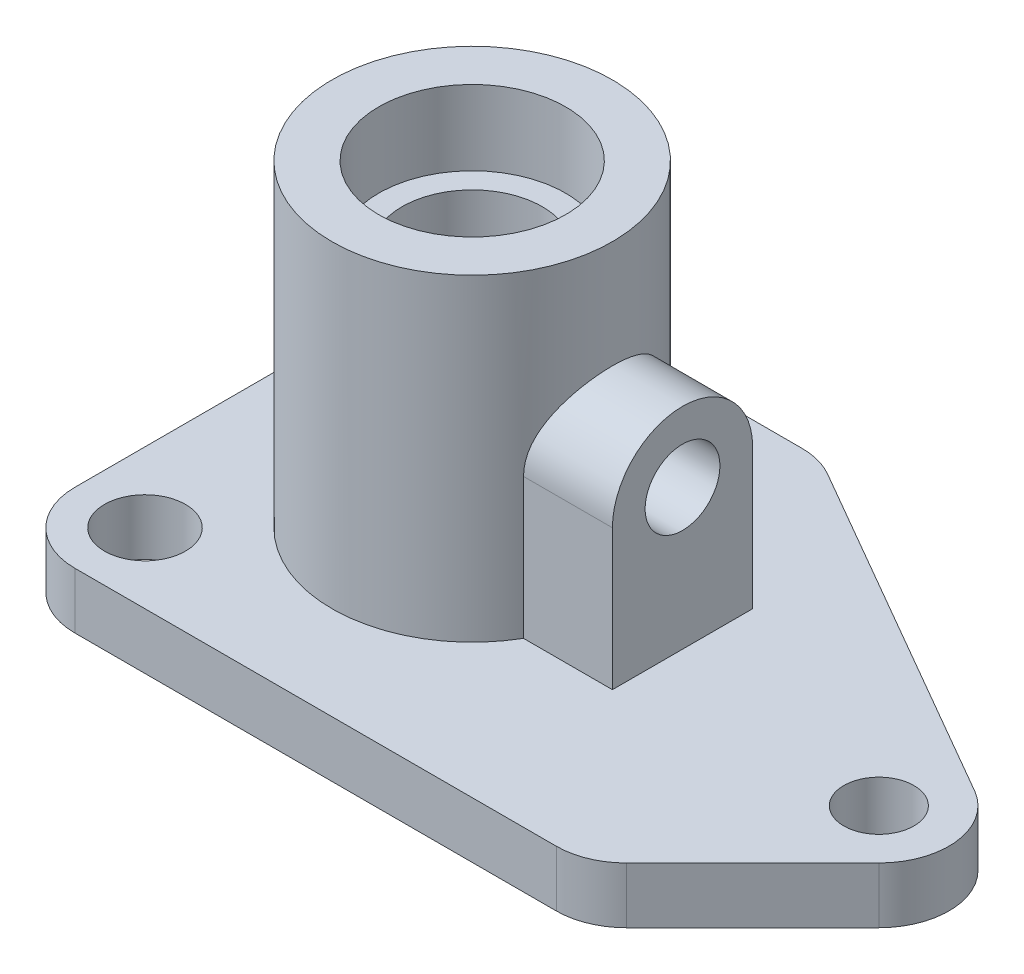
ISO-10303-21;
HEADER;
FILE_DESCRIPTION(('STEP AP214'),'2;1');
FILE_NAME('part.step','',(''),(''),'','','');
FILE_SCHEMA(('AUTOMOTIVE_DESIGN { 1 0 10303 214 1 1 1 1 }'));
ENDSEC;
DATA;
#1=APPLICATION_CONTEXT('core data for automotive mechanical design processes');
#2=APPLICATION_PROTOCOL_DEFINITION('international standard','automotive_design',2000,#1);
#3=PRODUCT_CONTEXT('',#1,'mechanical');
#4=PRODUCT('Part','Part','',(#3));
#5=PRODUCT_RELATED_PRODUCT_CATEGORY('part','',(#4));
#6=PRODUCT_DEFINITION_FORMATION('','',#4);
#7=PRODUCT_DEFINITION_CONTEXT('part definition',#1,'design');
#8=PRODUCT_DEFINITION('design','',#6,#7);
#9=PRODUCT_DEFINITION_SHAPE('','',#8);
#10=(LENGTH_UNIT() NAMED_UNIT(*) SI_UNIT(.MILLI.,.METRE.));
#11=(NAMED_UNIT(*) PLANE_ANGLE_UNIT() SI_UNIT($,.RADIAN.));
#12=(NAMED_UNIT(*) SI_UNIT($,.STERADIAN.) SOLID_ANGLE_UNIT());
#13=UNCERTAINTY_MEASURE_WITH_UNIT(LENGTH_MEASURE(1.E-05),#10,'distance_accuracy_value','');
#14=(GEOMETRIC_REPRESENTATION_CONTEXT(3) GLOBAL_UNCERTAINTY_ASSIGNED_CONTEXT((#13)) GLOBAL_UNIT_ASSIGNED_CONTEXT((#10,
#11,#12)) REPRESENTATION_CONTEXT('',''));
#15=CARTESIAN_POINT('',(0.,0.,0.));
#16=DIRECTION('',(0.,0.,1.));
#17=DIRECTION('',(1.,0.,0.));
#18=AXIS2_PLACEMENT_3D('',#15,#16,#17);
#19=CARTESIAN_POINT('',(145.,12.,-42.));
#20=DIRECTION('',(0.,-1.,0.));
#21=DIRECTION('',(0.,0.,-1.));
#22=AXIS2_PLACEMENT_3D('',#19,#20,#21);
#23=PLANE('',#22);
#24=DIRECTION('',(0.,0.,-1.));
#25=VECTOR('',#24,1.);
#26=CARTESIAN_POINT('',(95.,12.,-35.));
#27=LINE('',#26,#25);
#28=CARTESIAN_POINT('',(95.,12.,-35.));
#29=VERTEX_POINT('',#28);
#30=CARTESIAN_POINT('',(95.,12.,-65.));
#31=VERTEX_POINT('',#30);
#32=EDGE_CURVE('E283',#29,#31,#27,.T.);
#33=ORIENTED_EDGE('',*,*,#32,.F.);
#34=DIRECTION('',(1.,0.,0.));
#35=VECTOR('',#34,1.);
#36=CARTESIAN_POINT('',(-0.001000000000001,12.,-35.));
#37=LINE('',#36,#35);
#38=CARTESIAN_POINT('',(75.9807621135332,12.,-35.));
#39=VERTEX_POINT('',#38);
#40=EDGE_CURVE('E273',#39,#29,#37,.T.);
#41=ORIENTED_EDGE('',*,*,#40,.F.);
#42=CARTESIAN_POINT('',(50.,12.,-50.));
#43=DIRECTION('',(0.,-1.,0.));
#44=DIRECTION('',(0.,0.,-1.));
#45=AXIS2_PLACEMENT_3D('',#42,#43,#44);
#46=CIRCLE('',#45,30.);
#47=CARTESIAN_POINT('',(75.9807621135332,12.,-65.));
#48=VERTEX_POINT('',#47);
#49=EDGE_CURVE('E11',#48,#39,#46,.F.);
#50=ORIENTED_EDGE('',*,*,#49,.F.);
#51=DIRECTION('',(1.,0.,0.));
#52=VECTOR('',#51,1.);
#53=CARTESIAN_POINT('',(-0.001000000000001,12.,-65.));
#54=LINE('',#53,#52);
#55=EDGE_CURVE('E277',#48,#31,#54,.T.);
#56=ORIENTED_EDGE('',*,*,#55,.T.);
#57=EDGE_LOOP('',(#33,#41,#50,#56));
#58=FACE_BOUND('',#57,.T.);
#59=CARTESIAN_POINT('',(145.,12.,-42.));
#60=DIRECTION('',(0.,1.,0.));
#61=DIRECTION('',(0.,0.,-1.));
#62=AXIS2_PLACEMENT_3D('',#59,#60,#61);
#63=CIRCLE('',#62,15.);
#64=CARTESIAN_POINT('',(155.606601717798,12.,-31.3933982822018));
#65=VERTEX_POINT('',#64);
#66=CARTESIAN_POINT('',(152.5,12.,-54.9903810567666));
#67=VERTEX_POINT('',#66);
#68=EDGE_CURVE('E174',#65,#67,#63,.T.);
#69=ORIENTED_EDGE('',*,*,#68,.T.);
#70=DIRECTION('',(-0.866025403784438,0.,-0.500000000000001));
#71=VECTOR('',#70,1.);
#72=CARTESIAN_POINT('',(78.0218152745385,12.,-97.9903810567666));
#73=LINE('',#72,#71);
#74=CARTESIAN_POINT('',(78.0218152745385,12.,-97.9903810567666));
#75=VERTEX_POINT('',#74);
#76=EDGE_CURVE('E105',#67,#75,#73,.T.);
#77=ORIENTED_EDGE('',*,*,#76,.T.);
#78=CARTESIAN_POINT('',(70.5218152745385,12.,-85.));
#79=DIRECTION('',(0.,1.,0.));
#80=DIRECTION('',(0.,0.,1.));
#81=AXIS2_PLACEMENT_3D('',#78,#79,#80);
#82=CIRCLE('',#81,15.);
#83=CARTESIAN_POINT('',(70.5218152745385,12.,-100.));
#84=VERTEX_POINT('',#83);
#85=EDGE_CURVE('E214',#75,#84,#82,.T.);
#86=ORIENTED_EDGE('',*,*,#85,.T.);
#87=DIRECTION('',(-1.,0.,0.));
#88=VECTOR('',#87,1.);
#89=CARTESIAN_POINT('',(15.0000000000001,12.,-100.));
#90=LINE('',#89,#88);
#91=CARTESIAN_POINT('',(15.0000000000001,12.,-100.));
#92=VERTEX_POINT('',#91);
#93=EDGE_CURVE('E211',#84,#92,#90,.T.);
#94=ORIENTED_EDGE('',*,*,#93,.T.);
#95=CARTESIAN_POINT('',(15.,12.,-85.));
#96=DIRECTION('',(0.,1.,0.));
#97=DIRECTION('',(0.,0.,-1.));
#98=AXIS2_PLACEMENT_3D('',#95,#96,#97);
#99=CIRCLE('',#98,15.);
#100=CARTESIAN_POINT('',(0.,12.,-84.9999999999999));
#101=VERTEX_POINT('',#100);
#102=EDGE_CURVE('E213',#92,#101,#99,.T.);
#103=ORIENTED_EDGE('',*,*,#102,.T.);
#104=DIRECTION('',(0.,0.,1.));
#105=VECTOR('',#104,1.);
#106=CARTESIAN_POINT('',(0.,12.,-15.));
#107=LINE('',#106,#105);
#108=CARTESIAN_POINT('',(0.,12.,-15.));
#109=VERTEX_POINT('',#108);
#110=EDGE_CURVE('E216',#101,#109,#107,.T.);
#111=ORIENTED_EDGE('',*,*,#110,.T.);
#112=CARTESIAN_POINT('',(15.,12.,-15.));
#113=DIRECTION('',(0.,1.,0.));
#114=DIRECTION('',(0.,0.,-1.));
#115=AXIS2_PLACEMENT_3D('',#112,#113,#114);
#116=CIRCLE('',#115,15.);
#117=CARTESIAN_POINT('',(15.,12.,0.));
#118=VERTEX_POINT('',#117);
#119=EDGE_CURVE('E133',#109,#118,#116,.T.);
#120=ORIENTED_EDGE('',*,*,#119,.T.);
#121=DIRECTION('',(1.,0.,0.));
#122=VECTOR('',#121,1.);
#123=CARTESIAN_POINT('',(118.,12.,0.));
#124=LINE('',#123,#122);
#125=CARTESIAN_POINT('',(118.,12.,0.));
#126=VERTEX_POINT('',#125);
#127=EDGE_CURVE('E126',#118,#126,#124,.T.);
#128=ORIENTED_EDGE('',*,*,#127,.T.);
#129=CARTESIAN_POINT('',(118.,12.,-15.));
#130=DIRECTION('',(0.,1.,0.));
#131=DIRECTION('',(0.,0.,-1.));
#132=AXIS2_PLACEMENT_3D('',#129,#130,#131);
#133=CIRCLE('',#132,15.);
#134=CARTESIAN_POINT('',(128.606601717798,12.,-4.39339828220181));
#135=VERTEX_POINT('',#134);
#136=EDGE_CURVE('E130',#126,#135,#133,.T.);
#137=ORIENTED_EDGE('',*,*,#136,.T.);
#138=DIRECTION('',(0.707106781186546,0.,-0.707106781186549));
#139=VECTOR('',#138,1.);
#140=CARTESIAN_POINT('',(155.606601717798,12.,-31.3933982822018));
#141=LINE('',#140,#139);
#142=EDGE_CURVE('E57',#135,#65,#141,.T.);
#143=ORIENTED_EDGE('',*,*,#142,.T.);
#144=EDGE_LOOP('',(#69,#77,#86,#94,#103,#111,#120,#128,#137,#143));
#145=FACE_BOUND('',#144,.T.);
#146=CARTESIAN_POINT('',(15.,12.,-85.));
#147=DIRECTION('',(0.,1.,0.));
#148=DIRECTION('',(0.,0.,1.));
#149=AXIS2_PLACEMENT_3D('',#146,#147,#148);
#150=CIRCLE('',#149,7.5);
#151=CARTESIAN_POINT('',(15.,12.,-77.5));
#152=VERTEX_POINT('',#151);
#153=EDGE_CURVE('E158',#152,#152,#150,.T.);
#154=ORIENTED_EDGE('',*,*,#153,.F.);
#155=EDGE_LOOP('',(#154));
#156=FACE_BOUND('',#155,.T.);
#157=CARTESIAN_POINT('',(15.,12.,-15.));
#158=DIRECTION('',(0.,1.,0.));
#159=DIRECTION('',(0.,0.,1.));
#160=AXIS2_PLACEMENT_3D('',#157,#158,#159);
#161=CIRCLE('',#160,8.66710245401889);
#162=CARTESIAN_POINT('',(15.,12.,-6.33289754598109));
#163=VERTEX_POINT('',#162);
#164=EDGE_CURVE('E236',#163,#163,#161,.T.);
#165=ORIENTED_EDGE('',*,*,#164,.F.);
#166=EDGE_LOOP('',(#165));
#167=FACE_BOUND('',#166,.T.);
#168=CARTESIAN_POINT('',(145.,12.,-42.));
#169=DIRECTION('',(0.,1.,0.));
#170=DIRECTION('',(0.,0.,1.));
#171=AXIS2_PLACEMENT_3D('',#168,#169,#170);
#172=CIRCLE('',#171,7.50000000000001);
#173=CARTESIAN_POINT('',(145.,12.,-34.5));
#174=VERTEX_POINT('',#173);
#175=EDGE_CURVE('E242',#174,#174,#172,.T.);
#176=ORIENTED_EDGE('',*,*,#175,.F.);
#177=EDGE_LOOP('',(#176));
#178=FACE_BOUND('',#177,.T.);
#179=ADVANCED_FACE('F33',(#58,#145,#156,#167,#178),#23,.F.);
#180=CARTESIAN_POINT('',(145.,0.,-42.));
#181=DIRECTION('',(0.,-1.,0.));
#182=DIRECTION('',(0.,0.,-1.));
#183=AXIS2_PLACEMENT_3D('',#180,#181,#182);
#184=PLANE('',#183);
#185=CARTESIAN_POINT('',(50.,0.,-50.));
#186=DIRECTION('',(0.,1.,0.));
#187=DIRECTION('',(0.,0.,1.));
#188=AXIS2_PLACEMENT_3D('',#185,#186,#187);
#189=CIRCLE('',#188,15.);
#190=CARTESIAN_POINT('',(50.,0.,-35.));
#191=VERTEX_POINT('',#190);
#192=EDGE_CURVE('E253',#191,#191,#189,.T.);
#193=ORIENTED_EDGE('',*,*,#192,.T.);
#194=EDGE_LOOP('',(#193));
#195=FACE_BOUND('',#194,.T.);
#196=CARTESIAN_POINT('',(15.,0.,-15.));
#197=DIRECTION('',(0.,1.,0.));
#198=DIRECTION('',(0.,0.,1.));
#199=AXIS2_PLACEMENT_3D('',#196,#197,#198);
#200=CIRCLE('',#199,8.66710245401889);
#201=CARTESIAN_POINT('',(15.,0.,-6.33289754598109));
#202=VERTEX_POINT('',#201);
#203=EDGE_CURVE('E239',#202,#202,#200,.T.);
#204=ORIENTED_EDGE('',*,*,#203,.T.);
#205=EDGE_LOOP('',(#204));
#206=FACE_BOUND('',#205,.T.);
#207=CARTESIAN_POINT('',(145.,0.,-42.));
#208=DIRECTION('',(0.,1.,0.));
#209=DIRECTION('',(0.,0.,-1.));
#210=AXIS2_PLACEMENT_3D('',#207,#208,#209);
#211=CIRCLE('',#210,15.);
#212=CARTESIAN_POINT('',(155.606601717798,0.,-31.3933982822018));
#213=VERTEX_POINT('',#212);
#214=CARTESIAN_POINT('',(152.5,0.,-54.9903810567666));
#215=VERTEX_POINT('',#214);
#216=EDGE_CURVE('E154',#213,#215,#211,.T.);
#217=ORIENTED_EDGE('',*,*,#216,.F.);
#218=DIRECTION('',(0.707106781186546,0.,-0.707106781186549));
#219=VECTOR('',#218,1.);
#220=CARTESIAN_POINT('',(155.606601717798,0.,-31.3933982822018));
#221=LINE('',#220,#219);
#222=CARTESIAN_POINT('',(128.606601717798,0.,-4.39339828220181));
#223=VERTEX_POINT('',#222);
#224=EDGE_CURVE('E96',#223,#213,#221,.T.);
#225=ORIENTED_EDGE('',*,*,#224,.F.);
#226=CARTESIAN_POINT('',(118.,0.,-15.));
#227=DIRECTION('',(0.,1.,0.));
#228=DIRECTION('',(0.,0.,-1.));
#229=AXIS2_PLACEMENT_3D('',#226,#227,#228);
#230=CIRCLE('',#229,15.);
#231=CARTESIAN_POINT('',(118.,0.,0.));
#232=VERTEX_POINT('',#231);
#233=EDGE_CURVE('E171',#232,#223,#230,.T.);
#234=ORIENTED_EDGE('',*,*,#233,.F.);
#235=DIRECTION('',(1.,0.,0.));
#236=VECTOR('',#235,1.);
#237=CARTESIAN_POINT('',(118.,0.,0.));
#238=LINE('',#237,#236);
#239=CARTESIAN_POINT('',(15.,0.,0.));
#240=VERTEX_POINT('',#239);
#241=EDGE_CURVE('E142',#240,#232,#238,.T.);
#242=ORIENTED_EDGE('',*,*,#241,.F.);
#243=CARTESIAN_POINT('',(15.,0.,-15.));
#244=DIRECTION('',(0.,1.,0.));
#245=DIRECTION('',(0.,0.,-1.));
#246=AXIS2_PLACEMENT_3D('',#243,#244,#245);
#247=CIRCLE('',#246,15.);
#248=CARTESIAN_POINT('',(0.,0.,-15.));
#249=VERTEX_POINT('',#248);
#250=EDGE_CURVE('E168',#249,#240,#247,.T.);
#251=ORIENTED_EDGE('',*,*,#250,.F.);
#252=DIRECTION('',(0.,0.,1.));
#253=VECTOR('',#252,1.);
#254=CARTESIAN_POINT('',(0.,0.,-15.));
#255=LINE('',#254,#253);
#256=CARTESIAN_POINT('',(0.,0.,-84.9999999999999));
#257=VERTEX_POINT('',#256);
#258=EDGE_CURVE('E166',#257,#249,#255,.T.);
#259=ORIENTED_EDGE('',*,*,#258,.F.);
#260=CARTESIAN_POINT('',(15.,0.,-85.));
#261=DIRECTION('',(0.,1.,0.));
#262=DIRECTION('',(0.,0.,-1.));
#263=AXIS2_PLACEMENT_3D('',#260,#261,#262);
#264=CIRCLE('',#263,15.);
#265=CARTESIAN_POINT('',(15.0000000000001,0.,-100.));
#266=VERTEX_POINT('',#265);
#267=EDGE_CURVE('E164',#266,#257,#264,.T.);
#268=ORIENTED_EDGE('',*,*,#267,.F.);
#269=DIRECTION('',(-1.,0.,0.));
#270=VECTOR('',#269,1.);
#271=CARTESIAN_POINT('',(15.0000000000001,0.,-100.));
#272=LINE('',#271,#270);
#273=CARTESIAN_POINT('',(70.5218152745385,0.,-100.));
#274=VERTEX_POINT('',#273);
#275=EDGE_CURVE('E162',#274,#266,#272,.T.);
#276=ORIENTED_EDGE('',*,*,#275,.F.);
#277=CARTESIAN_POINT('',(70.5218152745385,0.,-85.));
#278=DIRECTION('',(0.,1.,0.));
#279=DIRECTION('',(0.,0.,1.));
#280=AXIS2_PLACEMENT_3D('',#277,#278,#279);
#281=CIRCLE('',#280,15.);
#282=CARTESIAN_POINT('',(78.0218152745385,0.,-97.9903810567666));
#283=VERTEX_POINT('',#282);
#284=EDGE_CURVE('E160',#283,#274,#281,.T.);
#285=ORIENTED_EDGE('',*,*,#284,.F.);
#286=DIRECTION('',(-0.866025403784438,0.,-0.500000000000001));
#287=VECTOR('',#286,1.);
#288=CARTESIAN_POINT('',(78.0218152745385,0.,-97.9903810567666));
#289=LINE('',#288,#287);
#290=EDGE_CURVE('E157',#215,#283,#289,.T.);
#291=ORIENTED_EDGE('',*,*,#290,.F.);
#292=EDGE_LOOP('',(#217,#225,#234,#242,#251,#259,#268,#276,#285,#291));
#293=FACE_BOUND('',#292,.T.);
#294=CARTESIAN_POINT('',(15.,0.,-85.));
#295=DIRECTION('',(0.,1.,0.));
#296=DIRECTION('',(0.,0.,1.));
#297=AXIS2_PLACEMENT_3D('',#294,#295,#296);
#298=CIRCLE('',#297,7.5);
#299=CARTESIAN_POINT('',(15.,0.,-77.5));
#300=VERTEX_POINT('',#299);
#301=EDGE_CURVE('E233',#300,#300,#298,.T.);
#302=ORIENTED_EDGE('',*,*,#301,.T.);
#303=EDGE_LOOP('',(#302));
#304=FACE_BOUND('',#303,.T.);
#305=CARTESIAN_POINT('',(145.,0.,-42.));
#306=DIRECTION('',(0.,1.,0.));
#307=DIRECTION('',(0.,0.,1.));
#308=AXIS2_PLACEMENT_3D('',#305,#306,#307);
#309=CIRCLE('',#308,7.50000000000001);
#310=CARTESIAN_POINT('',(145.,0.,-34.5));
#311=VERTEX_POINT('',#310);
#312=EDGE_CURVE('E245',#311,#311,#309,.T.);
#313=ORIENTED_EDGE('',*,*,#312,.T.);
#314=EDGE_LOOP('',(#313));
#315=FACE_BOUND('',#314,.T.);
#316=ADVANCED_FACE('F198',(#195,#206,#293,#304,#315),#184,.T.);
#317=CARTESIAN_POINT('',(145.,12.,-42.));
#318=DIRECTION('',(0.,-1.,0.));
#319=DIRECTION('',(0.,0.,-1.));
#320=AXIS2_PLACEMENT_3D('',#317,#318,#319);
#321=CYLINDRICAL_SURFACE('',#320,15.);
#322=ORIENTED_EDGE('',*,*,#216,.T.);
#323=DIRECTION('',(0.,-1.,0.));
#324=VECTOR('',#323,1.);
#325=CARTESIAN_POINT('',(152.5,12.,-54.9903810567666));
#326=LINE('',#325,#324);
#327=EDGE_CURVE('E41',#67,#215,#326,.T.);
#328=ORIENTED_EDGE('',*,*,#327,.F.);
#329=ORIENTED_EDGE('',*,*,#68,.F.);
#330=DIRECTION('',(0.,-1.,0.));
#331=VECTOR('',#330,1.);
#332=CARTESIAN_POINT('',(155.606601717798,12.,-31.3933982822018));
#333=LINE('',#332,#331);
#334=EDGE_CURVE('E150',#65,#213,#333,.T.);
#335=ORIENTED_EDGE('',*,*,#334,.T.);
#336=EDGE_LOOP('',(#322,#328,#329,#335));
#337=FACE_BOUND('',#336,.T.);
#338=ADVANCED_FACE('F35',(#337),#321,.T.);
#339=CARTESIAN_POINT('',(78.0218152745385,12.,-97.9903810567666));
#340=DIRECTION('',(-0.500000000000001,0.,0.866025403784438));
#341=DIRECTION('',(0.866025403784438,0.,0.500000000000001));
#342=AXIS2_PLACEMENT_3D('',#339,#340,#341);
#343=PLANE('',#342);
#344=ORIENTED_EDGE('',*,*,#290,.T.);
#345=DIRECTION('',(0.,-1.,0.));
#346=VECTOR('',#345,1.);
#347=CARTESIAN_POINT('',(78.0218152745385,12.,-97.9903810567666));
#348=LINE('',#347,#346);
#349=EDGE_CURVE('E190',#75,#283,#348,.T.);
#350=ORIENTED_EDGE('',*,*,#349,.F.);
#351=ORIENTED_EDGE('',*,*,#76,.F.);
#352=ORIENTED_EDGE('',*,*,#327,.T.);
#353=EDGE_LOOP('',(#344,#350,#351,#352));
#354=FACE_BOUND('',#353,.T.);
#355=ADVANCED_FACE('F193',(#354),#343,.F.);
#356=CARTESIAN_POINT('',(70.5218152745385,12.,-85.));
#357=DIRECTION('',(0.,-1.,0.));
#358=DIRECTION('',(0.,0.,-1.));
#359=AXIS2_PLACEMENT_3D('',#356,#357,#358);
#360=CYLINDRICAL_SURFACE('',#359,15.);
#361=ORIENTED_EDGE('',*,*,#284,.T.);
#362=DIRECTION('',(0.,-1.,0.));
#363=VECTOR('',#362,1.);
#364=CARTESIAN_POINT('',(70.5218152745385,12.,-100.));
#365=LINE('',#364,#363);
#366=EDGE_CURVE('E187',#84,#274,#365,.T.);
#367=ORIENTED_EDGE('',*,*,#366,.F.);
#368=ORIENTED_EDGE('',*,*,#85,.F.);
#369=ORIENTED_EDGE('',*,*,#349,.T.);
#370=EDGE_LOOP('',(#361,#367,#368,#369));
#371=FACE_BOUND('',#370,.T.);
#372=ADVANCED_FACE('F205',(#371),#360,.T.);
#373=CARTESIAN_POINT('',(15.0000000000001,12.,-100.));
#374=DIRECTION('',(0.,0.,1.));
#375=DIRECTION('',(1.,0.,0.));
#376=AXIS2_PLACEMENT_3D('',#373,#374,#375);
#377=PLANE('',#376);
#378=ORIENTED_EDGE('',*,*,#275,.T.);
#379=DIRECTION('',(0.,-1.,0.));
#380=VECTOR('',#379,1.);
#381=CARTESIAN_POINT('',(15.0000000000001,12.,-100.));
#382=LINE('',#381,#380);
#383=EDGE_CURVE('E184',#92,#266,#382,.T.);
#384=ORIENTED_EDGE('',*,*,#383,.F.);
#385=ORIENTED_EDGE('',*,*,#93,.F.);
#386=ORIENTED_EDGE('',*,*,#366,.T.);
#387=EDGE_LOOP('',(#378,#384,#385,#386));
#388=FACE_BOUND('',#387,.T.);
#389=ADVANCED_FACE('F209',(#388),#377,.F.);
#390=CARTESIAN_POINT('',(15.,12.,-85.));
#391=DIRECTION('',(0.,-1.,0.));
#392=DIRECTION('',(0.,0.,-1.));
#393=AXIS2_PLACEMENT_3D('',#390,#391,#392);
#394=CYLINDRICAL_SURFACE('',#393,15.);
#395=ORIENTED_EDGE('',*,*,#267,.T.);
#396=DIRECTION('',(0.,-1.,0.));
#397=VECTOR('',#396,1.);
#398=CARTESIAN_POINT('',(0.,12.,-84.9999999999999));
#399=LINE('',#398,#397);
#400=EDGE_CURVE('E181',#101,#257,#399,.T.);
#401=ORIENTED_EDGE('',*,*,#400,.F.);
#402=ORIENTED_EDGE('',*,*,#102,.F.);
#403=ORIENTED_EDGE('',*,*,#383,.T.);
#404=EDGE_LOOP('',(#395,#401,#402,#403));
#405=FACE_BOUND('',#404,.T.);
#406=ADVANCED_FACE('F352',(#405),#394,.T.);
#407=CARTESIAN_POINT('',(0.,12.,-15.));
#408=DIRECTION('',(1.,0.,0.));
#409=DIRECTION('',(0.,0.,-1.));
#410=AXIS2_PLACEMENT_3D('',#407,#408,#409);
#411=PLANE('',#410);
#412=ORIENTED_EDGE('',*,*,#258,.T.);
#413=DIRECTION('',(0.,-1.,0.));
#414=VECTOR('',#413,1.);
#415=CARTESIAN_POINT('',(0.,12.,-15.));
#416=LINE('',#415,#414);
#417=EDGE_CURVE('E178',#109,#249,#416,.T.);
#418=ORIENTED_EDGE('',*,*,#417,.F.);
#419=ORIENTED_EDGE('',*,*,#110,.F.);
#420=ORIENTED_EDGE('',*,*,#400,.T.);
#421=EDGE_LOOP('',(#412,#418,#419,#420));
#422=FACE_BOUND('',#421,.T.);
#423=ADVANCED_FACE('F225',(#422),#411,.F.);
#424=CARTESIAN_POINT('',(15.,12.,-15.));
#425=DIRECTION('',(0.,-1.,0.));
#426=DIRECTION('',(0.,0.,-1.));
#427=AXIS2_PLACEMENT_3D('',#424,#425,#426);
#428=CYLINDRICAL_SURFACE('',#427,15.);
#429=ORIENTED_EDGE('',*,*,#250,.T.);
#430=DIRECTION('',(0.,-1.,0.));
#431=VECTOR('',#430,1.);
#432=CARTESIAN_POINT('',(15.,12.,0.));
#433=LINE('',#432,#431);
#434=EDGE_CURVE('E145',#118,#240,#433,.T.);
#435=ORIENTED_EDGE('',*,*,#434,.F.);
#436=ORIENTED_EDGE('',*,*,#119,.F.);
#437=ORIENTED_EDGE('',*,*,#417,.T.);
#438=EDGE_LOOP('',(#429,#435,#436,#437));
#439=FACE_BOUND('',#438,.T.);
#440=ADVANCED_FACE('F229',(#439),#428,.T.);
#441=CARTESIAN_POINT('',(118.,12.,0.));
#442=DIRECTION('',(0.,0.,-1.));
#443=DIRECTION('',(-1.,0.,0.));
#444=AXIS2_PLACEMENT_3D('',#441,#442,#443);
#445=PLANE('',#444);
#446=ORIENTED_EDGE('',*,*,#241,.T.);
#447=DIRECTION('',(0.,-1.,0.));
#448=VECTOR('',#447,1.);
#449=CARTESIAN_POINT('',(118.,12.,0.));
#450=LINE('',#449,#448);
#451=EDGE_CURVE('E139',#126,#232,#450,.T.);
#452=ORIENTED_EDGE('',*,*,#451,.F.);
#453=ORIENTED_EDGE('',*,*,#127,.F.);
#454=ORIENTED_EDGE('',*,*,#434,.T.);
#455=EDGE_LOOP('',(#446,#452,#453,#454));
#456=FACE_BOUND('',#455,.T.);
#457=ADVANCED_FACE('F140',(#456),#445,.F.);
#458=CARTESIAN_POINT('',(118.,12.,-15.));
#459=DIRECTION('',(0.,-1.,0.));
#460=DIRECTION('',(0.,0.,-1.));
#461=AXIS2_PLACEMENT_3D('',#458,#459,#460);
#462=CYLINDRICAL_SURFACE('',#461,15.);
#463=ORIENTED_EDGE('',*,*,#233,.T.);
#464=DIRECTION('',(0.,-1.,0.));
#465=VECTOR('',#464,1.);
#466=CARTESIAN_POINT('',(128.606601717798,12.,-4.39339828220181));
#467=LINE('',#466,#465);
#468=EDGE_CURVE('E146',#135,#223,#467,.T.);
#469=ORIENTED_EDGE('',*,*,#468,.F.);
#470=ORIENTED_EDGE('',*,*,#136,.F.);
#471=ORIENTED_EDGE('',*,*,#451,.T.);
#472=EDGE_LOOP('',(#463,#469,#470,#471));
#473=FACE_BOUND('',#472,.T.);
#474=ADVANCED_FACE('F148',(#473),#462,.T.);
#475=CARTESIAN_POINT('',(155.606601717798,12.,-31.3933982822018));
#476=DIRECTION('',(-0.707106781186549,0.,-0.707106781186546));
#477=DIRECTION('',(-0.707106781186546,0.,0.707106781186549));
#478=AXIS2_PLACEMENT_3D('',#475,#476,#477);
#479=PLANE('',#478);
#480=ORIENTED_EDGE('',*,*,#224,.T.);
#481=ORIENTED_EDGE('',*,*,#334,.F.);
#482=ORIENTED_EDGE('',*,*,#142,.F.);
#483=ORIENTED_EDGE('',*,*,#468,.T.);
#484=EDGE_LOOP('',(#480,#481,#482,#483));
#485=FACE_BOUND('',#484,.T.);
#486=ADVANCED_FACE('F230',(#485),#479,.F.);
#487=CARTESIAN_POINT('',(15.,12.,-85.));
#488=DIRECTION('',(0.,-1.,0.));
#489=DIRECTION('',(0.,0.,-1.));
#490=AXIS2_PLACEMENT_3D('',#487,#488,#489);
#491=CYLINDRICAL_SURFACE('',#490,7.5);
#492=ORIENTED_EDGE('',*,*,#153,.T.);
#493=EDGE_LOOP('',(#492));
#494=FACE_BOUND('',#493,.T.);
#495=ORIENTED_EDGE('',*,*,#301,.F.);
#496=EDGE_LOOP('',(#495));
#497=FACE_BOUND('',#496,.T.);
#498=ADVANCED_FACE('F339',(#494,#497),#491,.F.);
#499=CARTESIAN_POINT('',(15.,12.,-15.));
#500=DIRECTION('',(0.,-1.,0.));
#501=DIRECTION('',(0.,0.,-1.));
#502=AXIS2_PLACEMENT_3D('',#499,#500,#501);
#503=CYLINDRICAL_SURFACE('',#502,8.66710245401889);
#504=ORIENTED_EDGE('',*,*,#164,.T.);
#505=EDGE_LOOP('',(#504));
#506=FACE_BOUND('',#505,.T.);
#507=ORIENTED_EDGE('',*,*,#203,.F.);
#508=EDGE_LOOP('',(#507));
#509=FACE_BOUND('',#508,.T.);
#510=ADVANCED_FACE('F502',(#506,#509),#503,.F.);
#511=CARTESIAN_POINT('',(145.,12.,-42.));
#512=DIRECTION('',(0.,-1.,0.));
#513=DIRECTION('',(0.,0.,-1.));
#514=AXIS2_PLACEMENT_3D('',#511,#512,#513);
#515=CYLINDRICAL_SURFACE('',#514,7.50000000000001);
#516=ORIENTED_EDGE('',*,*,#175,.T.);
#517=EDGE_LOOP('',(#516));
#518=FACE_BOUND('',#517,.T.);
#519=ORIENTED_EDGE('',*,*,#312,.F.);
#520=EDGE_LOOP('',(#519));
#521=FACE_BOUND('',#520,.T.);
#522=ADVANCED_FACE('F376',(#518,#521),#515,.F.);
#523=CARTESIAN_POINT('',(50.,80.,-50.));
#524=DIRECTION('',(0.,-1.,0.));
#525=DIRECTION('',(0.,0.,-1.));
#526=AXIS2_PLACEMENT_3D('',#523,#524,#525);
#527=CYLINDRICAL_SURFACE('',#526,30.);
#528=ORIENTED_EDGE('',*,*,#49,.T.);
#529=DIRECTION('',(0.,-1.,0.));
#530=VECTOR('',#529,1.);
#531=CARTESIAN_POINT('',(75.9807621135332,80.,-35.));
#532=LINE('',#531,#530);
#533=CARTESIAN_POINT('',(75.9807621135332,42.,-35.));
#534=VERTEX_POINT('',#533);
#535=EDGE_CURVE('E266',#534,#39,#532,.T.);
#536=ORIENTED_EDGE('',*,*,#535,.F.);
#537=CARTESIAN_POINT('',(75.9807621135332,42.,-65.));
#538=CARTESIAN_POINT('',(75.9807576058378,42.1964211737014,-65.0000014586861));
#539=CARTESIAN_POINT('',(75.982990538063,42.3928145922056,-64.9961410253277));
#540=CARTESIAN_POINT('',(75.9918850828363,42.7851904161284,-64.9807217891875));
#541=CARTESIAN_POINT('',(75.9985465080492,42.9811728385814,-64.96916331205));
#542=CARTESIAN_POINT('',(76.0250894816853,43.5676631493245,-64.923004587271));
#543=CARTESIAN_POINT('',(76.0515298833532,43.9570488234314,-64.8769209519161));
#544=CARTESIAN_POINT('',(76.1207142812994,44.7272936541326,-64.7551046213978));
#545=CARTESIAN_POINT('',(76.1633639655667,45.108188888957,-64.6795433725615));
#546=CARTESIAN_POINT('',(76.2634626880331,45.8611836057245,-64.4996932012343));
#547=CARTESIAN_POINT('',(76.3209134260895,46.2332820720222,-64.3954009789806));
#548=CARTESIAN_POINT('',(76.4485633992913,46.9655050657005,-64.1594990520545));
#549=CARTESIAN_POINT('',(76.518734375251,47.3256540826482,-64.0279498105325));
#550=CARTESIAN_POINT('',(76.6697691636221,48.0329069485381,-63.7386324656628));
#551=CARTESIAN_POINT('',(76.7506328390558,48.3800109645188,-63.5808646981782));
#552=CARTESIAN_POINT('',(76.9209053023691,49.060004166304,-63.2401344172292));
#553=CARTESIAN_POINT('',(77.0103249671684,49.392874458586,-63.0571396999027));
#554=CARTESIAN_POINT('',(77.1953538928623,50.0426566531954,-62.667252991225));
#555=CARTESIAN_POINT('',(77.2909654272152,50.359562617126,-62.4603522002049));
#556=CARTESIAN_POINT('',(77.4940416013945,51.0012428652471,-62.0060202915584));
#557=CARTESIAN_POINT('',(77.6018366884021,51.3245475353844,-61.7566593246679));
#558=CARTESIAN_POINT('',(77.819160525639,51.9494487341284,-61.2327527557754));
#559=CARTESIAN_POINT('',(77.9286893641779,52.2510441525933,-60.9582058674764));
#560=CARTESIAN_POINT('',(78.14680386406,52.8311981571442,-60.3851551427764));
#561=CARTESIAN_POINT('',(78.2553891048753,53.1097469004882,-60.0866411766941));
#562=CARTESIAN_POINT('',(78.4689028160071,53.6420726735415,-59.4672511746413));
#563=CARTESIAN_POINT('',(78.5738325019758,53.8958579898596,-59.1463826812182));
#564=CARTESIAN_POINT('',(78.7844701667965,54.3935451769665,-58.4611629435477));
#565=CARTESIAN_POINT('',(78.8897475431564,54.6356069619156,-58.0953385538428));
#566=CARTESIAN_POINT('',(79.0903697156252,55.087806445776,-57.3418244839768));
#567=CARTESIAN_POINT('',(79.1857139389794,55.2979423041286,-56.9541335449546));
#568=CARTESIAN_POINT('',(79.3636813031735,55.684119945096,-56.159535538964));
#569=CARTESIAN_POINT('',(79.4463105116056,55.8601780000115,-55.7526377593773));
#570=CARTESIAN_POINT('',(79.5964174793187,56.17629340074,-54.9223925172622));
#571=CARTESIAN_POINT('',(79.663896849139,56.3163545735156,-54.4990468088878));
#572=CARTESIAN_POINT('',(79.7774087047019,56.5500422424673,-53.6699275251457));
#573=CARTESIAN_POINT('',(79.8246255092075,56.6462634757717,-53.2650467160156));
#574=CARTESIAN_POINT('',(79.9028443675128,56.8048936810044,-52.4471632004766));
#575=CARTESIAN_POINT('',(79.9338471258447,56.8673041220823,-52.034160847774));
#576=CARTESIAN_POINT('',(79.9787263678888,56.9574584513598,-51.203668285772));
#577=CARTESIAN_POINT('',(79.9926113000344,56.9852194407393,-50.7861803930069));
#578=CARTESIAN_POINT('',(80.0028704579857,57.0057430542475,-49.9501406157733));
#579=CARTESIAN_POINT('',(79.999245754939,56.9985078192614,-49.5315887979559));
#580=CARTESIAN_POINT('',(79.9756757579812,56.9513038636156,-48.7334483113866));
#581=CARTESIAN_POINT('',(79.9571791883982,56.9142405222008,-48.3536406621529));
#582=CARTESIAN_POINT('',(79.9061492399208,56.811473775629,-47.598902174869));
#583=CARTESIAN_POINT('',(79.8736168493391,56.745772386977,-47.2239709953634));
#584=CARTESIAN_POINT('',(79.7952951631271,56.5864464300131,-46.4815123998443));
#585=CARTESIAN_POINT('',(79.749505688478,56.4928214846315,-46.1139850838814));
#586=CARTESIAN_POINT('',(79.6457358925711,56.2786004904909,-45.3886460568508));
#587=CARTESIAN_POINT('',(79.5877551341967,56.1580034746432,-45.0308346946666));
#588=CARTESIAN_POINT('',(79.4600324402276,55.889121511087,-44.3221560027238));
#589=CARTESIAN_POINT('',(79.3901396232668,55.7404783498445,-43.9714520121268));
#590=CARTESIAN_POINT('',(79.2407172676897,55.4178975177903,-43.2840346494859));
#591=CARTESIAN_POINT('',(79.1611877383789,55.2439598714038,-42.9473212639325));
#592=CARTESIAN_POINT('',(78.9941837176493,54.8720740739322,-42.2894551392435));
#593=CARTESIAN_POINT('',(78.906708375512,54.6741233511239,-41.9683040719457));
#594=CARTESIAN_POINT('',(78.725602553475,54.2554426903726,-41.3428752082716));
#595=CARTESIAN_POINT('',(78.6319696870863,54.0347039012817,-41.0386040393219));
#596=CARTESIAN_POINT('',(78.4314467576268,53.5499074527673,-40.4204316549642));
#597=CARTESIAN_POINT('',(78.3241391637724,53.2837277438249,-40.1083279843677));
#598=CARTESIAN_POINT('',(78.1070653776815,52.7271978613452,-39.5073850767557));
#599=CARTESIAN_POINT('',(77.9972990468664,52.4368463229235,-39.2185471552763));
#600=CARTESIAN_POINT('',(77.7779260342178,51.83322355555,-38.6652988568817));
#601=CARTESIAN_POINT('',(77.6683195441758,51.5199345930728,-38.4009077455207));
#602=CARTESIAN_POINT('',(77.4521400450541,50.8720491314456,-37.8981442843099));
#603=CARTESIAN_POINT('',(77.3455675894768,50.5374487800222,-37.6597766597542));
#604=CARTESIAN_POINT('',(77.1316776588673,49.8262517650801,-37.1960389997153));
#605=CARTESIAN_POINT('',(77.0247557536844,49.4483383836066,-36.9724998373553));
#606=CARTESIAN_POINT('',(76.8212607568788,48.6723377378251,-36.5585276487437));
#607=CARTESIAN_POINT('',(76.7246828683129,48.2742599518356,-36.3680792512319));
#608=CARTESIAN_POINT('',(76.5455193293328,47.4609197560501,-36.022401415014));
#609=CARTESIAN_POINT('',(76.4629087118953,47.045689696508,-35.8671089615612));
#610=CARTESIAN_POINT('',(76.3148344795481,46.2004001015154,-35.5932725476409));
#611=CARTESIAN_POINT('',(76.249363436808,45.7703470816844,-35.4747126641649));
#612=CARTESIAN_POINT('',(76.1593117622387,45.0630628979423,-35.313428789843));
#613=CARTESIAN_POINT('',(76.1286151139285,44.789225889193,-35.2589564076533));
#614=CARTESIAN_POINT('',(76.0755516723914,44.2382018693776,-35.1652938951263));
#615=CARTESIAN_POINT('',(76.0531825719251,43.9610158082104,-35.126099531703));
#616=CARTESIAN_POINT('',(76.0171763507084,43.4038435038715,-35.063202356288));
#617=CARTESIAN_POINT('',(76.0035543237941,43.1238532626,-35.0395263210693));
#618=CARTESIAN_POINT('',(75.9853296531589,42.5625800852335,-35.0079121406615));
#619=CARTESIAN_POINT('',(75.9807306970768,42.2812966676836,-34.999980430005));
#620=CARTESIAN_POINT('',(75.9807621135332,42.,-35.));
#621=B_SPLINE_CURVE_WITH_KNOTS('',3,(#537,#538,#539,#540,#541,#542,#543,#544,#545,#546,#547,
#548,#549,#550,#551,#552,#553,#554,#555,#556,#557,#558,#559,#560,#561,#562,#563,#564,#565,#566,
#567,#568,#569,#570,#571,#572,#573,#574,#575,#576,#577,#578,#579,#580,#581,#582,#583,#584,#585,
#586,#587,#588,#589,#590,#591,#592,#593,#594,#595,#596,#597,#598,#599,#600,#601,#602,#603,#604,
#605,#606,#607,#608,#609,#610,#611,#612,#613,#614,#615,#616,#617,#618,#619,#620),.UNSPECIFIED.,
.F.,.F.,(4,2,2,2,2,2,2,2,2,2,2,2,2,2,2,2,2,2,2,2,2,2,2,2,2,2,2,2,2,2,2,2,2,2,2,2,2,2,2,2,2,4),
(0.,0.589158077480656,1.17829123385306,2.35555703256039,3.52607537567189,4.69672820932809,
5.86481151084261,7.03287985019272,8.20245335695368,9.3724587558578,10.6379774507587,
11.9035608143296,13.1696819211084,14.4353778810607,15.7869844975327,17.1386690058151,
18.4897064778727,19.8406002566331,21.0953807608752,22.350106737908,23.6042132018104,
24.8582429470319,26.0030687180118,27.1478138908218,28.2925745225585,29.4373762064918,
30.5979332338978,31.758489140637,32.9191694490945,34.0803022875584,35.3509282474113,
36.6216260030503,37.8933167590647,39.1652380435005,40.5192232439467,41.8725778024018,
43.2234870079104,44.5738097929056,45.4159682938013,46.2578932914021,47.101267227134,
47.9449857696203),.UNSPECIFIED.);
#622=CARTESIAN_POINT('',(75.9807621135332,42.,-65.));
#623=VERTEX_POINT('',#622);
#624=EDGE_CURVE('E265',#623,#534,#621,.T.);
#625=ORIENTED_EDGE('',*,*,#624,.F.);
#626=DIRECTION('',(0.,-1.,0.));
#627=VECTOR('',#626,1.);
#628=CARTESIAN_POINT('',(75.9807621135332,80.,-65.));
#629=LINE('',#628,#627);
#630=EDGE_CURVE('E48',#48,#623,#629,.F.);
#631=ORIENTED_EDGE('',*,*,#630,.F.);
#632=EDGE_LOOP('',(#528,#536,#625,#631));
#633=FACE_BOUND('',#632,.T.);
#634=CARTESIAN_POINT('',(50.,80.,-50.));
#635=DIRECTION('',(0.,1.,0.));
#636=DIRECTION('',(0.,0.,1.));
#637=AXIS2_PLACEMENT_3D('',#634,#635,#636);
#638=CIRCLE('',#637,30.);
#639=CARTESIAN_POINT('',(50.,80.,-20.));
#640=VERTEX_POINT('',#639);
#641=EDGE_CURVE('E248',#640,#640,#638,.T.);
#642=ORIENTED_EDGE('',*,*,#641,.F.);
#643=EDGE_LOOP('',(#642));
#644=FACE_BOUND('',#643,.T.);
#645=ADVANCED_FACE('F387',(#633,#644),#527,.T.);
#646=CARTESIAN_POINT('',(50.,80.,-50.));
#647=DIRECTION('',(0.,1.,0.));
#648=DIRECTION('',(0.,0.,1.));
#649=AXIS2_PLACEMENT_3D('',#646,#647,#648);
#650=PLANE('',#649);
#651=CARTESIAN_POINT('',(50.,80.,-50.));
#652=DIRECTION('',(0.,1.,0.));
#653=DIRECTION('',(0.,0.,1.));
#654=AXIS2_PLACEMENT_3D('',#651,#652,#653);
#655=CIRCLE('',#654,20.);
#656=CARTESIAN_POINT('',(50.,80.,-30.));
#657=VERTEX_POINT('',#656);
#658=EDGE_CURVE('E262',#657,#657,#655,.T.);
#659=ORIENTED_EDGE('',*,*,#658,.F.);
#660=EDGE_LOOP('',(#659));
#661=FACE_BOUND('',#660,.T.);
#662=ORIENTED_EDGE('',*,*,#641,.T.);
#663=EDGE_LOOP('',(#662));
#664=FACE_BOUND('',#663,.T.);
#665=ADVANCED_FACE('F381',(#661,#664),#650,.T.);
#666=CARTESIAN_POINT('',(50.,80.,-50.));
#667=DIRECTION('',(0.,1.,0.));
#668=DIRECTION('',(0.,0.,1.));
#669=AXIS2_PLACEMENT_3D('',#666,#667,#668);
#670=CYLINDRICAL_SURFACE('',#669,15.);
#671=CARTESIAN_POINT('',(62.6885775404495,42.,-58.));
#672=CARTESIAN_POINT('',(62.6885765278676,41.7937192721858,-58.0000008272168));
#673=CARTESIAN_POINT('',(62.6936244616965,41.5874478094631,-57.9920117465462));
#674=CARTESIAN_POINT('',(62.7136132089408,41.1765400452813,-57.9601753756348));
#675=CARTESIAN_POINT('',(62.7285577429431,40.9719043880904,-57.9363221213075));
#676=CARTESIAN_POINT('',(62.7677833039786,40.5656970070215,-57.8730609533485));
#677=CARTESIAN_POINT('',(62.7920765809839,40.3641296654285,-57.8336326293767));
#678=CARTESIAN_POINT('',(62.8491080572074,39.9656728398993,-57.7397308597286));
#679=CARTESIAN_POINT('',(62.8818499962724,39.7687854698374,-57.6852507505399));
#680=CARTESIAN_POINT('',(62.9544169307915,39.382225971615,-57.562283856669));
#681=CARTESIAN_POINT('',(62.9941952837499,39.1925157493011,-57.493888887073));
#682=CARTESIAN_POINT('',(63.0797616840841,38.8198944209796,-57.3435222093617));
#683=CARTESIAN_POINT('',(63.1255519303831,38.636985834318,-57.2615455306837));
#684=CARTESIAN_POINT('',(63.2218490629248,38.2788389065522,-57.0846895469615));
#685=CARTESIAN_POINT('',(63.2723552820083,38.1035994856423,-56.9898120661042));
#686=CARTESIAN_POINT('',(63.3767912234906,37.7614752245375,-56.787814381606));
#687=CARTESIAN_POINT('',(63.4307210623106,37.5945906687975,-56.6806937615346));
#688=CARTESIAN_POINT('',(63.6062056303797,37.0765057725667,-56.3203291392312));
#689=CARTESIAN_POINT('',(63.7320055318079,36.7417984075306,-56.0446381397056));
#690=CARTESIAN_POINT('',(63.9190407271586,36.2763747176437,-55.5934784767501));
#691=CARTESIAN_POINT('',(63.98114670239,36.1272578696831,-55.4367114622067));
#692=CARTESIAN_POINT('',(64.1034342850555,35.8417949839788,-55.111099246349));
#693=CARTESIAN_POINT('',(64.1636155805015,35.7054510098599,-54.9422521010768));
#694=CARTESIAN_POINT('',(64.2852717014807,35.4361169759681,-54.5793564204602));
#695=CARTESIAN_POINT('',(64.3464672523525,35.3042605704662,-54.3843718855975));
#696=CARTESIAN_POINT('',(64.4632110268051,35.0576470940577,-53.9823740452922));
#697=CARTESIAN_POINT('',(64.5187616932943,34.9428826162644,-53.7753660046832));
#698=CARTESIAN_POINT('',(64.6226346324678,34.7315814491715,-53.3505739486297));
#699=CARTESIAN_POINT('',(64.6709590609995,34.635039321225,-53.132793172987));
#700=CARTESIAN_POINT('',(64.7589385631076,34.4613076311535,-52.6879564214534));
#701=CARTESIAN_POINT('',(64.79859470852,34.3841156762,-52.4609015964273));
#702=CARTESIAN_POINT('',(64.8652391133083,34.255446230202,-52.017636321279));
#703=CARTESIAN_POINT('',(64.8929813683055,34.2024175171566,-51.801989060477));
#704=CARTESIAN_POINT('',(64.9392726976933,34.1143627031601,-51.3660730196162));
#705=CARTESIAN_POINT('',(64.9578222162598,34.0793357323956,-51.1458044633857));
#706=CARTESIAN_POINT('',(64.9851777815143,34.0277964070218,-50.7026411515942));
#707=CARTESIAN_POINT('',(64.9939895843996,34.0112731143672,-50.4797480263248));
#708=CARTESIAN_POINT('',(65.0016248937834,33.9969512517853,-50.033196491315));
#709=CARTESIAN_POINT('',(65.0004491267833,33.9991513199105,-49.8095381384208));
#710=CARTESIAN_POINT('',(64.9887583249268,34.0210937843026,-49.3855289421314));
#711=CARTESIAN_POINT('',(64.9791774779261,34.0390815395962,-49.1850585247776));
#712=CARTESIAN_POINT('',(64.9521717230929,34.0900122168023,-48.7865591131412));
#713=CARTESIAN_POINT('',(64.9347467575056,34.1229552488278,-48.5885301368456));
#714=CARTESIAN_POINT('',(64.8924644313709,34.203419538788,-48.1962758245567));
#715=CARTESIAN_POINT('',(64.8676071445479,34.2509406521162,-48.0020504508539));
#716=CARTESIAN_POINT('',(64.811029806268,34.3600538160736,-47.6186221187677));
#717=CARTESIAN_POINT('',(64.7793094942225,34.4216464010002,-47.4294193513984));
#718=CARTESIAN_POINT('',(64.7092919056294,34.559112170632,-47.0549308969535));
#719=CARTESIAN_POINT('',(64.6709217934464,34.6351445072312,-46.8697172651735));
#720=CARTESIAN_POINT('',(64.5886953872264,34.8003370473644,-46.5064769951695));
#721=CARTESIAN_POINT('',(64.5448372834282,34.8895015831957,-46.3284527535077));
#722=CARTESIAN_POINT('',(64.4063856676657,35.1756349776768,-45.8065116110289));
#723=CARTESIAN_POINT('',(64.3048709118572,35.3913274108832,-45.4745002880332));
#724=CARTESIAN_POINT('',(64.0802637401869,35.8918980326676,-44.8154367278165));
#725=CARTESIAN_POINT('',(63.9560254510799,36.1816280179133,-44.4924592201553));
#726=CARTESIAN_POINT('',(63.7688338304178,36.6519684276943,-44.0463965983022));
#727=CARTESIAN_POINT('',(63.7062463622372,36.8148531576382,-43.9040095533527));
#728=CARTESIAN_POINT('',(63.5822961853234,37.1519741451727,-43.6326263093139));
#729=CARTESIAN_POINT('',(63.5209336798982,37.3262122669659,-43.503632318399));
#730=CARTESIAN_POINT('',(63.3962802284654,37.6995699245948,-43.2500959468781));
#731=CARTESIAN_POINT('',(63.3332248820359,37.8995659105282,-43.1267261995524));
#732=CARTESIAN_POINT('',(63.2125488792136,38.3108189127637,-42.8975128043656));
#733=CARTESIAN_POINT('',(63.154925782791,38.5220708058107,-42.7916612714656));
#734=CARTESIAN_POINT('',(63.0472441446601,38.9546088013315,-42.5985375292258));
#735=CARTESIAN_POINT('',(62.9971807093155,39.1758882909095,-42.5112532855329));
#736=CARTESIAN_POINT('',(62.9066564433152,39.6271145725832,-42.356290840712));
#737=CARTESIAN_POINT('',(62.8661941335559,39.8570600233092,-42.2886096192811));
#738=CARTESIAN_POINT('',(62.7995566447755,40.304826823555,-42.178545628336));
#739=CARTESIAN_POINT('',(62.7724893252618,40.5221203951472,-42.1345570805214));
#740=CARTESIAN_POINT('',(62.7292029555451,40.9606769553906,-42.0646932276579));
#741=CARTESIAN_POINT('',(62.7129832381527,41.1819396990553,-42.0388168086052));
#742=CARTESIAN_POINT('',(62.6921440125065,41.6262169138435,-42.0056352731238));
#743=CARTESIAN_POINT('',(62.6875148968984,41.8492297803713,-41.9983147757825));
#744=CARTESIAN_POINT('',(62.6900500928086,42.2950087829972,-42.0023353862064));
#745=CARTESIAN_POINT('',(62.6972133099323,42.5177749400714,-42.0136747622309));
#746=CARTESIAN_POINT('',(62.7212695878385,42.9314055673793,-42.052061997675));
#747=CARTESIAN_POINT('',(62.7367415686164,43.122571744454,-42.0768195627407));
#748=CARTESIAN_POINT('',(62.7757602066192,43.501879972745,-42.1398901216992));
#749=CARTESIAN_POINT('',(62.7993094794345,43.6900210236786,-42.1782075066634));
#750=CARTESIAN_POINT('',(62.8537208452296,44.0620403765168,-42.2679493910613));
#751=CARTESIAN_POINT('',(62.8845823961677,44.2459189932766,-42.3193729189894));
#752=CARTESIAN_POINT('',(62.9527088743853,44.6085243534616,-42.4348283219238));
#753=CARTESIAN_POINT('',(62.9899763599403,44.7872490051693,-42.4988652357112));
#754=CARTESIAN_POINT('',(63.0716388473629,45.1463708025722,-42.642055891249));
#755=CARTESIAN_POINT('',(63.1162747460405,45.3264975806232,-42.7217494087028));
#756=CARTESIAN_POINT('',(63.2102058334669,45.6794698550921,-42.8936609100652));
#757=CARTESIAN_POINT('',(63.2595025712086,45.8523129030337,-42.9858830622465));
#758=CARTESIAN_POINT('',(63.3615387544223,46.19006493222,-43.1822638891372));
#759=CARTESIAN_POINT('',(63.4142789991174,46.3549720560332,-43.2864253391749));
#760=CARTESIAN_POINT('',(63.5220005778033,46.6762602765561,-43.5061206080734));
#761=CARTESIAN_POINT('',(63.5769820657783,46.8326407857148,-43.6216552090988));
#762=CARTESIAN_POINT('',(63.6962134405586,47.1587368925019,-43.8814175993796));
#763=CARTESIAN_POINT('',(63.7606355432632,47.3270233849148,-44.0273650535625));
#764=CARTESIAN_POINT('',(63.8892269606575,47.650904310487,-44.3328280960227));
#765=CARTESIAN_POINT('',(63.9533962645304,47.806498206047,-44.4923442584237));
#766=CARTESIAN_POINT('',(64.0799012133675,48.1042434790001,-44.8242933252926));
#767=CARTESIAN_POINT('',(64.1422360134202,48.2463887271338,-44.9967320557098));
#768=CARTESIAN_POINT('',(64.2634999947603,48.5162849020849,-45.3536999832584));
#769=CARTESIAN_POINT('',(64.3224287354076,48.6440339684972,-45.5382307381689));
#770=CARTESIAN_POINT('',(64.4377604357269,48.8892029387392,-45.9264551479055));
#771=CARTESIAN_POINT('',(64.4939538454569,49.0059650296516,-46.1306278946901));
#772=CARTESIAN_POINT('',(64.5994119794807,49.2216115391982,-46.5498048368839));
#773=CARTESIAN_POINT('',(64.6486799933833,49.3205044522261,-46.7648038233883));
#774=CARTESIAN_POINT('',(64.7388392730691,49.4992893599529,-47.2041339661071));
#775=CARTESIAN_POINT('',(64.7797350637035,49.5791916221162,-47.4284600021301));
#776=CARTESIAN_POINT('',(64.8519055817779,49.7189823650214,-47.8847636360957));
#777=CARTESIAN_POINT('',(64.8831816411609,49.7788736165766,-48.1167401698253));
#778=CARTESIAN_POINT('',(64.9325301276959,49.872857512634,-48.5630379876304));
#779=CARTESIAN_POINT('',(64.9516024544314,49.9089157868437,-48.7768364529618));
#780=CARTESIAN_POINT('',(64.980590276506,49.9635812341489,-49.2072671409284));
#781=CARTESIAN_POINT('',(64.9905063889356,49.9821895832976,-49.4238991715949));
#782=CARTESIAN_POINT('',(65.0009003023475,50.0016921517047,-49.8581003498611));
#783=CARTESIAN_POINT('',(65.0013817505881,50.0025932162566,-50.0756691028067));
#784=CARTESIAN_POINT('',(64.9929015247902,49.9866853541949,-50.5099679836115));
#785=CARTESIAN_POINT('',(64.9839402423169,49.9698771619378,-50.7266981458708));
#786=CARTESIAN_POINT('',(64.9579364778125,49.9208744237052,-51.1399362487835));
#787=CARTESIAN_POINT('',(64.9416116877612,49.8900446570979,-51.3366534346782));
#788=CARTESIAN_POINT('',(64.9015877717357,49.8139852072276,-51.726587663177));
#789=CARTESIAN_POINT('',(64.8778861596536,49.7687506692054,-51.9198035025051));
#790=CARTESIAN_POINT('',(64.8236550798794,49.6643809638333,-52.3013868513123));
#791=CARTESIAN_POINT('',(64.7931277152739,49.6052500778094,-52.4897558342677));
#792=CARTESIAN_POINT('',(64.7258931428121,49.4736289395168,-52.8607027992969));
#793=CARTESIAN_POINT('',(64.6891835654033,49.4011335638207,-53.0432785288916));
#794=CARTESIAN_POINT('',(64.6088870094687,49.2404833527258,-53.4083187492969));
#795=CARTESIAN_POINT('',(64.5650946183864,49.1518453827168,-53.5905252105687));
#796=CARTESIAN_POINT('',(64.4726171787797,48.9615775336053,-53.9468014769449));
#797=CARTESIAN_POINT('',(64.4239303457008,48.8599429121142,-54.1208682801224));
#798=CARTESIAN_POINT('',(64.3226773019176,48.6444064319034,-54.4600727403021));
#799=CARTESIAN_POINT('',(64.27011056727,48.5305029154306,-54.6252091861096));
#800=CARTESIAN_POINT('',(64.1621589491846,48.2911174913659,-54.9458957733568));
#801=CARTESIAN_POINT('',(64.1067738378156,48.1656346466468,-55.1014451372017));
#802=CARTESIAN_POINT('',(63.9880757213701,47.8892706968891,-55.4189988413115));
#803=CARTESIAN_POINT('',(63.9245623740845,47.7371149510063,-55.5798208931335));
#804=CARTESIAN_POINT('',(63.7969814658701,47.4201245314764,-55.8882219709236));
#805=CARTESIAN_POINT('',(63.7329138558113,47.2552887234298,-56.0357998094565));
#806=CARTESIAN_POINT('',(63.6057891395715,46.9135205231528,-56.317147958626));
#807=CARTESIAN_POINT('',(63.5427332358677,46.7365748876754,-56.4509027380205));
#808=CARTESIAN_POINT('',(63.4194175576809,46.3715300422086,-56.7036563418699));
#809=CARTESIAN_POINT('',(63.3591576233888,46.18343147109,-56.8226560103333));
#810=CARTESIAN_POINT('',(63.2400605704134,45.7864183868448,-57.0511191804652));
#811=CARTESIAN_POINT('',(63.1814769115307,45.5769282532982,-57.1597181585176));
#812=CARTESIAN_POINT('',(63.0714949582072,45.1475443643603,-57.3585967579289));
#813=CARTESIAN_POINT('',(63.0200978861982,44.9276488475162,-57.4488732638284));
#814=CARTESIAN_POINT('',(62.9267274695131,44.4795451157097,-57.6097539630003));
#815=CARTESIAN_POINT('',(62.8847276803626,44.2513623825686,-57.6804134981654));
#816=CARTESIAN_POINT('',(62.8119002549363,43.7880295610107,-57.8012954767393));
#817=CARTESIAN_POINT('',(62.7810652276082,43.5528841938069,-57.8515314432296));
#818=CARTESIAN_POINT('',(62.7342469976794,43.0988312152143,-57.9272156623638));
#819=CARTESIAN_POINT('',(62.717188631134,42.8803344730273,-57.9544680338432));
#820=CARTESIAN_POINT('',(62.6943542313888,42.4412216747368,-57.9908601016062));
#821=CARTESIAN_POINT('',(62.6885786233484,42.2206055390845,-57.9999991153385));
#822=CARTESIAN_POINT('',(62.6885775404495,42.,-58.));
#823=B_SPLINE_CURVE_WITH_KNOTS('',3,(#671,#672,#673,#674,#675,#676,#677,#678,#679,#680,#681,
#682,#683,#684,#685,#686,#687,#688,#689,#690,#691,#692,#693,#694,#695,#696,#697,#698,#699,#700,
#701,#702,#703,#704,#705,#706,#707,#708,#709,#710,#711,#712,#713,#714,#715,#716,#717,#718,#719,
#720,#721,#722,#723,#724,#725,#726,#727,#728,#729,#730,#731,#732,#733,#734,#735,#736,#737,#738,
#739,#740,#741,#742,#743,#744,#745,#746,#747,#748,#749,#750,#751,#752,#753,#754,#755,#756,#757,
#758,#759,#760,#761,#762,#763,#764,#765,#766,#767,#768,#769,#770,#771,#772,#773,#774,#775,#776,
#777,#778,#779,#780,#781,#782,#783,#784,#785,#786,#787,#788,#789,#790,#791,#792,#793,#794,#795,
#796,#797,#798,#799,#800,#801,#802,#803,#804,#805,#806,#807,#808,#809,#810,#811,#812,#813,#814,
#815,#816,#817,#818,#819,#820,#821,#822),.UNSPECIFIED.,.T.,.F.,(4,2,2,2,2,2,2,2,2,2,2,2,2,2,2,2,
2,2,2,2,2,2,2,2,2,2,2,2,2,2,2,2,2,2,2,2,2,2,2,2,2,2,2,2,2,2,2,2,2,2,2,2,2,2,2,2,2,2,2,2,2,2,2,2,
2,2,2,2,2,2,2,2,2,2,2,4),(0.,0.618612409650024,1.2374575162633,1.85711629277478,
2.47704983661099,3.09301829929053,3.70921269086573,4.32532004234233,4.94144835595199,
6.2893297741637,6.96411577792085,7.63901061484622,8.36770205136598,9.09607678055244,
9.82423377390032,10.5523006794077,11.2227676082844,11.893202138292,12.5632401460203,
13.2332294152304,13.8370243737463,14.4408237779643,15.0446171930172,15.6484335380709,
16.2593380665151,16.8704445849759,18.0919304974033,19.4399210054334,20.1150149937977,
20.7902201118518,21.5191974534642,22.247845780935,22.9760203876177,23.7040827422555,
24.3731385063228,25.0421531158554,25.7106130008442,26.3790108525116,26.9584945190621,
27.5381660115756,28.1177945478678,28.6976551048499,29.3029446478204,29.9084360658682,
30.5140685188859,31.1197426521452,31.8146386998427,32.5095641648474,33.2048048336834,
33.900135245042,34.6246245718508,35.3487685900283,36.0725201981181,36.796171550777,
37.4482560471201,38.1002965924857,38.7520850666368,39.4038465138907,40.0025200642457,
40.6013955961121,41.2000868617385,41.7990081214938,42.4202632353427,43.041745691238,
43.6633122264161,44.2849291098185,44.9751514824991,45.665435676684,46.356487212207,
47.0474992005699,47.7759050365521,48.5044346233654,49.2308875558424,49.9568586947103,
50.618404653886,51.2799755411001),.UNSPECIFIED.);
#824=CARTESIAN_POINT('',(62.6885775404495,42.,-58.));
#825=VERTEX_POINT('',#824);
#826=EDGE_CURVE('E292',#825,#825,#823,.T.);
#827=ORIENTED_EDGE('',*,*,#826,.F.);
#828=EDGE_LOOP('',(#827));
#829=FACE_BOUND('',#828,.T.);
#830=ORIENTED_EDGE('',*,*,#192,.F.);
#831=EDGE_LOOP('',(#830));
#832=FACE_BOUND('',#831,.T.);
#833=CARTESIAN_POINT('',(50.,64.,-50.));
#834=DIRECTION('',(0.,1.,0.));
#835=DIRECTION('',(0.,0.,1.));
#836=AXIS2_PLACEMENT_3D('',#833,#834,#835);
#837=CIRCLE('',#836,15.);
#838=CARTESIAN_POINT('',(50.,64.,-35.));
#839=VERTEX_POINT('',#838);
#840=EDGE_CURVE('E256',#839,#839,#837,.T.);
#841=ORIENTED_EDGE('',*,*,#840,.T.);
#842=EDGE_LOOP('',(#841));
#843=FACE_BOUND('',#842,.T.);
#844=ADVANCED_FACE('F386',(#829,#832,#843),#670,.F.);
#845=CARTESIAN_POINT('',(65.,64.,-50.));
#846=DIRECTION('',(0.,-1.,0.));
#847=DIRECTION('',(0.,0.,-1.));
#848=AXIS2_PLACEMENT_3D('',#845,#846,#847);
#849=PLANE('',#848);
#850=ORIENTED_EDGE('',*,*,#840,.F.);
#851=EDGE_LOOP('',(#850));
#852=FACE_BOUND('',#851,.T.);
#853=CARTESIAN_POINT('',(50.,64.,-50.));
#854=DIRECTION('',(0.,1.,0.));
#855=DIRECTION('',(0.,0.,1.));
#856=AXIS2_PLACEMENT_3D('',#853,#854,#855);
#857=CIRCLE('',#856,20.);
#858=CARTESIAN_POINT('',(50.,64.,-30.));
#859=VERTEX_POINT('',#858);
#860=EDGE_CURVE('E259',#859,#859,#857,.T.);
#861=ORIENTED_EDGE('',*,*,#860,.T.);
#862=EDGE_LOOP('',(#861));
#863=FACE_BOUND('',#862,.T.);
#864=ADVANCED_FACE('F397',(#852,#863),#849,.F.);
#865=CARTESIAN_POINT('',(50.,80.,-50.));
#866=DIRECTION('',(0.,1.,0.));
#867=DIRECTION('',(0.,0.,1.));
#868=AXIS2_PLACEMENT_3D('',#865,#866,#867);
#869=CYLINDRICAL_SURFACE('',#868,20.);
#870=ORIENTED_EDGE('',*,*,#860,.F.);
#871=EDGE_LOOP('',(#870));
#872=FACE_BOUND('',#871,.T.);
#873=ORIENTED_EDGE('',*,*,#658,.T.);
#874=EDGE_LOOP('',(#873));
#875=FACE_BOUND('',#874,.T.);
#876=ADVANCED_FACE('F320',(#872,#875),#869,.F.);
#877=CARTESIAN_POINT('',(95.,42.,-50.));
#878=DIRECTION('',(1.,0.,0.));
#879=DIRECTION('',(0.,0.,-1.));
#880=AXIS2_PLACEMENT_3D('',#877,#878,#879);
#881=PLANE('',#880);
#882=CARTESIAN_POINT('',(95.,42.,-50.));
#883=DIRECTION('',(1.,0.,0.));
#884=DIRECTION('',(0.,0.,-1.));
#885=AXIS2_PLACEMENT_3D('',#882,#883,#884);
#886=CIRCLE('',#885,8.);
#887=CARTESIAN_POINT('',(95.,42.,-58.));
#888=VERTEX_POINT('',#887);
#889=EDGE_CURVE('E468',#888,#888,#886,.T.);
#890=ORIENTED_EDGE('',*,*,#889,.F.);
#891=EDGE_LOOP('',(#890));
#892=FACE_BOUND('',#891,.T.);
#893=CARTESIAN_POINT('',(95.,42.,-50.));
#894=DIRECTION('',(1.,0.,0.));
#895=DIRECTION('',(0.,0.,-1.));
#896=AXIS2_PLACEMENT_3D('',#893,#894,#895);
#897=CIRCLE('',#896,15.);
#898=CARTESIAN_POINT('',(95.,42.,-65.));
#899=VERTEX_POINT('',#898);
#900=CARTESIAN_POINT('',(95.,42.,-35.));
#901=VERTEX_POINT('',#900);
#902=EDGE_CURVE('E289',#899,#901,#897,.T.);
#903=ORIENTED_EDGE('',*,*,#902,.T.);
#904=DIRECTION('',(0.,-1.,0.));
#905=VECTOR('',#904,1.);
#906=CARTESIAN_POINT('',(95.,42.,-35.));
#907=LINE('',#906,#905);
#908=EDGE_CURVE('E286',#901,#29,#907,.T.);
#909=ORIENTED_EDGE('',*,*,#908,.T.);
#910=ORIENTED_EDGE('',*,*,#32,.T.);
#911=DIRECTION('',(0.,1.,0.));
#912=VECTOR('',#911,1.);
#913=CARTESIAN_POINT('',(95.,12.,-65.));
#914=LINE('',#913,#912);
#915=EDGE_CURVE('E274',#31,#899,#914,.T.);
#916=ORIENTED_EDGE('',*,*,#915,.T.);
#917=EDGE_LOOP('',(#903,#909,#910,#916));
#918=FACE_BOUND('',#917,.T.);
#919=ADVANCED_FACE('F316',(#892,#918),#881,.T.);
#920=CARTESIAN_POINT('',(-0.001000000000001,42.,-35.));
#921=DIRECTION('',(0.,0.,1.));
#922=DIRECTION('',(1.,0.,0.));
#923=AXIS2_PLACEMENT_3D('',#920,#921,#922);
#924=PLANE('',#923);
#925=DIRECTION('',(1.,0.,0.));
#926=VECTOR('',#925,1.);
#927=CARTESIAN_POINT('',(-0.001000000000001,42.,-35.));
#928=LINE('',#927,#926);
#929=EDGE_CURVE('E270',#534,#901,#928,.T.);
#930=ORIENTED_EDGE('',*,*,#929,.F.);
#931=ORIENTED_EDGE('',*,*,#535,.T.);
#932=ORIENTED_EDGE('',*,*,#40,.T.);
#933=ORIENTED_EDGE('',*,*,#908,.F.);
#934=EDGE_LOOP('',(#930,#931,#932,#933));
#935=FACE_BOUND('',#934,.T.);
#936=ADVANCED_FACE('F319',(#935),#924,.T.);
#937=CARTESIAN_POINT('',(-0.001000000000001,12.,-65.));
#938=DIRECTION('',(0.,0.,-1.));
#939=DIRECTION('',(0.,1.,0.));
#940=AXIS2_PLACEMENT_3D('',#937,#938,#939);
#941=PLANE('',#940);
#942=ORIENTED_EDGE('',*,*,#55,.F.);
#943=ORIENTED_EDGE('',*,*,#630,.T.);
#944=DIRECTION('',(1.,0.,0.));
#945=VECTOR('',#944,1.);
#946=CARTESIAN_POINT('',(-0.001000000000001,42.,-65.));
#947=LINE('',#946,#945);
#948=EDGE_CURVE('E269',#623,#899,#947,.T.);
#949=ORIENTED_EDGE('',*,*,#948,.T.);
#950=ORIENTED_EDGE('',*,*,#915,.F.);
#951=EDGE_LOOP('',(#942,#943,#949,#950));
#952=FACE_BOUND('',#951,.T.);
#953=ADVANCED_FACE('F322',(#952),#941,.T.);
#954=CARTESIAN_POINT('',(-0.001000000000001,42.,-50.));
#955=DIRECTION('',(1.,0.,0.));
#956=DIRECTION('',(0.,0.,-1.));
#957=AXIS2_PLACEMENT_3D('',#954,#955,#956);
#958=CYLINDRICAL_SURFACE('',#957,15.);
#959=ORIENTED_EDGE('',*,*,#948,.F.);
#960=ORIENTED_EDGE('',*,*,#624,.T.);
#961=ORIENTED_EDGE('',*,*,#929,.T.);
#962=ORIENTED_EDGE('',*,*,#902,.F.);
#963=EDGE_LOOP('',(#959,#960,#961,#962));
#964=FACE_BOUND('',#963,.T.);
#965=ADVANCED_FACE('F308',(#964),#958,.T.);
#966=CARTESIAN_POINT('',(-0.001000000000001,42.,-50.));
#967=DIRECTION('',(1.,0.,0.));
#968=DIRECTION('',(0.,0.,-1.));
#969=AXIS2_PLACEMENT_3D('',#966,#967,#968);
#970=CYLINDRICAL_SURFACE('',#969,8.);
#971=ORIENTED_EDGE('',*,*,#826,.T.);
#972=EDGE_LOOP('',(#971));
#973=FACE_BOUND('',#972,.T.);
#974=ORIENTED_EDGE('',*,*,#889,.T.);
#975=EDGE_LOOP('',(#974));
#976=FACE_BOUND('',#975,.T.);
#977=ADVANCED_FACE('F314',(#973,#976),#970,.F.);
#978=CLOSED_SHELL('',(#179,#316,#338,#355,#372,#389,#406,#423,#440,#457,#474,#486,#498,#510,
#522,#645,#665,#844,#864,#876,#919,#936,#953,#965,#977));
#979=MANIFOLD_SOLID_BREP('B2',#978);
#980=ADVANCED_BREP_SHAPE_REPRESENTATION('',(#18,#979),#14);
#981=SHAPE_DEFINITION_REPRESENTATION(#9,#980);
ENDSEC;
END-ISO-10303-21;
